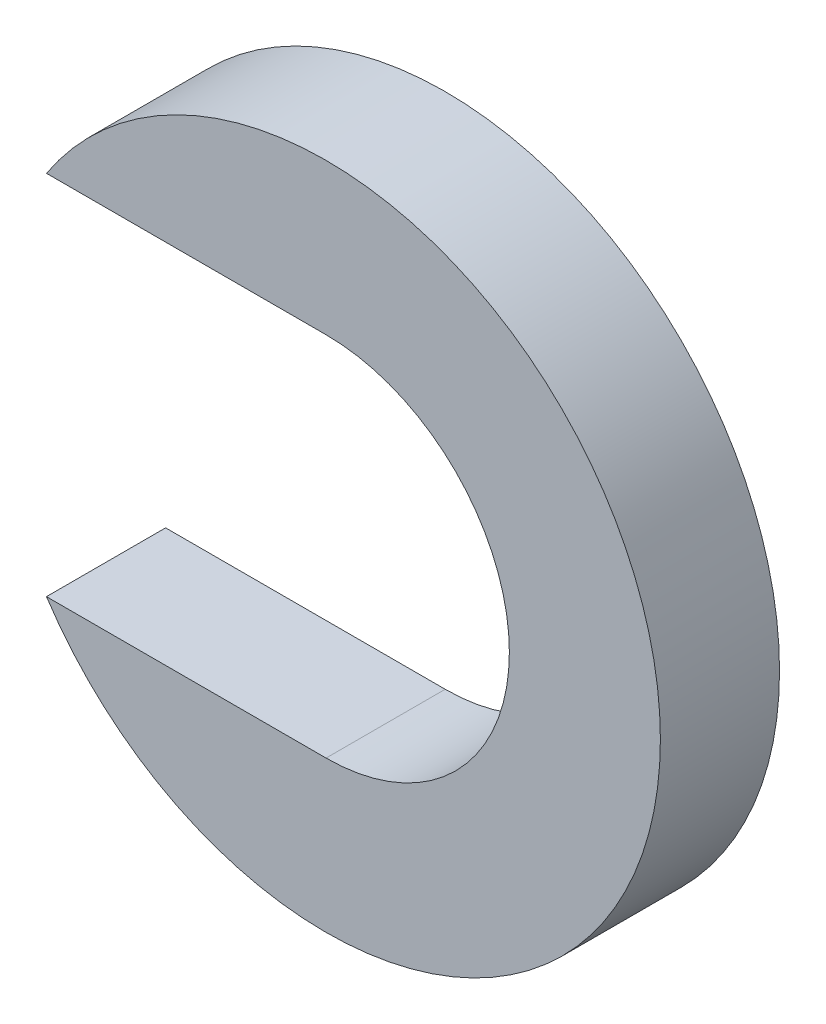
ISO-10303-21;
HEADER;
FILE_DESCRIPTION(('STEP AP214'),'2;1');
FILE_NAME('part.step','',(''),(''),'','','');
FILE_SCHEMA(('AUTOMOTIVE_DESIGN { 1 0 10303 214 1 1 1 1 }'));
ENDSEC;
DATA;
#1=APPLICATION_CONTEXT('core data for automotive mechanical design processes');
#2=APPLICATION_PROTOCOL_DEFINITION('international standard','automotive_design',2000,#1);
#3=PRODUCT_CONTEXT('',#1,'mechanical');
#4=PRODUCT('Part','Part','',(#3));
#5=PRODUCT_RELATED_PRODUCT_CATEGORY('part','',(#4));
#6=PRODUCT_DEFINITION_FORMATION('','',#4);
#7=PRODUCT_DEFINITION_CONTEXT('part definition',#1,'design');
#8=PRODUCT_DEFINITION('design','',#6,#7);
#9=PRODUCT_DEFINITION_SHAPE('','',#8);
#10=(LENGTH_UNIT() NAMED_UNIT(*) SI_UNIT(.MILLI.,.METRE.));
#11=(NAMED_UNIT(*) PLANE_ANGLE_UNIT() SI_UNIT($,.RADIAN.));
#12=(NAMED_UNIT(*) SI_UNIT($,.STERADIAN.) SOLID_ANGLE_UNIT());
#13=UNCERTAINTY_MEASURE_WITH_UNIT(LENGTH_MEASURE(1.E-05),#10,'distance_accuracy_value','');
#14=(GEOMETRIC_REPRESENTATION_CONTEXT(3) GLOBAL_UNCERTAINTY_ASSIGNED_CONTEXT((#13)) GLOBAL_UNIT_ASSIGNED_CONTEXT((#10,
#11,#12)) REPRESENTATION_CONTEXT('',''));
#15=CARTESIAN_POINT('',(0.,0.,0.));
#16=DIRECTION('',(0.,0.,1.));
#17=DIRECTION('',(1.,0.,0.));
#18=AXIS2_PLACEMENT_3D('',#15,#16,#17);
#19=CARTESIAN_POINT('',(0.,0.,3.25));
#20=DIRECTION('',(0.,0.,-1.));
#21=DIRECTION('',(-1.,0.,0.));
#22=AXIS2_PLACEMENT_3D('',#19,#20,#21);
#23=CYLINDRICAL_SURFACE('',#22,5.);
#24=CARTESIAN_POINT('',(0.,0.,0.));
#25=DIRECTION('',(0.,0.,1.));
#26=DIRECTION('',(1.,0.,0.));
#27=AXIS2_PLACEMENT_3D('',#24,#25,#26);
#28=CIRCLE('',#27,5.);
#29=CARTESIAN_POINT('',(0.,-5.,0.));
#30=VERTEX_POINT('',#29);
#31=CARTESIAN_POINT('',(0.,5.,0.));
#32=VERTEX_POINT('',#31);
#33=EDGE_CURVE('E98',#30,#32,#28,.T.);
#34=ORIENTED_EDGE('',*,*,#33,.F.);
#35=DIRECTION('',(0.,0.,-1.));
#36=VECTOR('',#35,1.);
#37=CARTESIAN_POINT('',(0.,-5.,3.25));
#38=LINE('',#37,#36);
#39=CARTESIAN_POINT('',(0.,-5.,3.25));
#40=VERTEX_POINT('',#39);
#41=EDGE_CURVE('E11',#40,#30,#38,.T.);
#42=ORIENTED_EDGE('',*,*,#41,.F.);
#43=CARTESIAN_POINT('',(0.,0.,3.25));
#44=DIRECTION('',(0.,0.,1.));
#45=DIRECTION('',(1.,0.,0.));
#46=AXIS2_PLACEMENT_3D('',#43,#44,#45);
#47=CIRCLE('',#46,5.);
#48=CARTESIAN_POINT('',(0.,5.,3.25));
#49=VERTEX_POINT('',#48);
#50=EDGE_CURVE('E92',#40,#49,#47,.T.);
#51=ORIENTED_EDGE('',*,*,#50,.T.);
#52=DIRECTION('',(0.,0.,-1.));
#53=VECTOR('',#52,1.);
#54=CARTESIAN_POINT('',(0.,5.,3.25));
#55=LINE('',#54,#53);
#56=EDGE_CURVE('E73',#49,#32,#55,.T.);
#57=ORIENTED_EDGE('',*,*,#56,.T.);
#58=EDGE_LOOP('',(#34,#42,#51,#57));
#59=FACE_BOUND('',#58,.T.);
#60=ADVANCED_FACE('F35',(#59),#23,.F.);
#61=CARTESIAN_POINT('',(0.,-5.,3.25));
#62=DIRECTION('',(0.,1.,0.));
#63=DIRECTION('',(0.,0.,1.));
#64=AXIS2_PLACEMENT_3D('',#61,#62,#63);
#65=PLANE('',#64);
#66=DIRECTION('',(1.,0.,0.));
#67=VECTOR('',#66,1.);
#68=CARTESIAN_POINT('',(0.,-5.,0.));
#69=LINE('',#68,#67);
#70=CARTESIAN_POINT('',(-7.62721443254351,-5.,0.));
#71=VERTEX_POINT('',#70);
#72=EDGE_CURVE('E86',#71,#30,#69,.T.);
#73=ORIENTED_EDGE('',*,*,#72,.F.);
#74=DIRECTION('',(0.,0.,-1.));
#75=VECTOR('',#74,1.);
#76=CARTESIAN_POINT('',(-7.62721443254351,-5.,3.25));
#77=LINE('',#76,#75);
#78=CARTESIAN_POINT('',(-7.62721443254351,-5.,3.25));
#79=VERTEX_POINT('',#78);
#80=EDGE_CURVE('E43',#79,#71,#77,.T.);
#81=ORIENTED_EDGE('',*,*,#80,.F.);
#82=DIRECTION('',(1.,0.,0.));
#83=VECTOR('',#82,1.);
#84=CARTESIAN_POINT('',(0.,-5.,3.25));
#85=LINE('',#84,#83);
#86=EDGE_CURVE('E84',#79,#40,#85,.T.);
#87=ORIENTED_EDGE('',*,*,#86,.T.);
#88=ORIENTED_EDGE('',*,*,#41,.T.);
#89=EDGE_LOOP('',(#73,#81,#87,#88));
#90=FACE_BOUND('',#89,.T.);
#91=ADVANCED_FACE('F82',(#90),#65,.T.);
#92=CARTESIAN_POINT('',(0.,0.,3.25));
#93=DIRECTION('',(0.,0.,-1.));
#94=DIRECTION('',(-1.,0.,0.));
#95=AXIS2_PLACEMENT_3D('',#92,#93,#94);
#96=CYLINDRICAL_SURFACE('',#95,9.12);
#97=CARTESIAN_POINT('',(0.,0.,0.));
#98=DIRECTION('',(0.,0.,1.));
#99=DIRECTION('',(1.,0.,0.));
#100=AXIS2_PLACEMENT_3D('',#97,#98,#99);
#101=CIRCLE('',#100,9.12);
#102=CARTESIAN_POINT('',(-7.62721443254351,5.,0.));
#103=VERTEX_POINT('',#102);
#104=EDGE_CURVE('E66',#71,#103,#101,.T.);
#105=ORIENTED_EDGE('',*,*,#104,.T.);
#106=DIRECTION('',(0.,0.,-1.));
#107=VECTOR('',#106,1.);
#108=CARTESIAN_POINT('',(-7.62721443254351,5.,3.25));
#109=LINE('',#108,#107);
#110=CARTESIAN_POINT('',(-7.62721443254351,5.,3.25));
#111=VERTEX_POINT('',#110);
#112=EDGE_CURVE('E87',#111,#103,#109,.T.);
#113=ORIENTED_EDGE('',*,*,#112,.F.);
#114=CARTESIAN_POINT('',(0.,0.,3.25));
#115=DIRECTION('',(0.,0.,1.));
#116=DIRECTION('',(1.,0.,0.));
#117=AXIS2_PLACEMENT_3D('',#114,#115,#116);
#118=CIRCLE('',#117,9.12);
#119=EDGE_CURVE('E88',#79,#111,#118,.T.);
#120=ORIENTED_EDGE('',*,*,#119,.F.);
#121=ORIENTED_EDGE('',*,*,#80,.T.);
#122=EDGE_LOOP('',(#105,#113,#120,#121));
#123=FACE_BOUND('',#122,.T.);
#124=ADVANCED_FACE('F89',(#123),#96,.T.);
#125=CARTESIAN_POINT('',(0.,5.,3.25));
#126=DIRECTION('',(0.,1.,0.));
#127=DIRECTION('',(0.,0.,1.));
#128=AXIS2_PLACEMENT_3D('',#125,#126,#127);
#129=PLANE('',#128);
#130=DIRECTION('',(1.,0.,0.));
#131=VECTOR('',#130,1.);
#132=CARTESIAN_POINT('',(0.,5.,0.));
#133=LINE('',#132,#131);
#134=EDGE_CURVE('E94',#103,#32,#133,.T.);
#135=ORIENTED_EDGE('',*,*,#134,.T.);
#136=ORIENTED_EDGE('',*,*,#56,.F.);
#137=DIRECTION('',(1.,0.,0.));
#138=VECTOR('',#137,1.);
#139=CARTESIAN_POINT('',(0.,5.,3.25));
#140=LINE('',#139,#138);
#141=EDGE_CURVE('E51',#111,#49,#140,.T.);
#142=ORIENTED_EDGE('',*,*,#141,.F.);
#143=ORIENTED_EDGE('',*,*,#112,.T.);
#144=EDGE_LOOP('',(#135,#136,#142,#143));
#145=FACE_BOUND('',#144,.T.);
#146=ADVANCED_FACE('F107',(#145),#129,.F.);
#147=CARTESIAN_POINT('',(0.,0.,3.25));
#148=DIRECTION('',(0.,0.,1.));
#149=DIRECTION('',(1.,0.,0.));
#150=AXIS2_PLACEMENT_3D('',#147,#148,#149);
#151=PLANE('',#150);
#152=ORIENTED_EDGE('',*,*,#50,.F.);
#153=ORIENTED_EDGE('',*,*,#86,.F.);
#154=ORIENTED_EDGE('',*,*,#119,.T.);
#155=ORIENTED_EDGE('',*,*,#141,.T.);
#156=EDGE_LOOP('',(#152,#153,#154,#155));
#157=FACE_BOUND('',#156,.T.);
#158=ADVANCED_FACE('F91',(#157),#151,.T.);
#159=CARTESIAN_POINT('',(0.,0.,0.));
#160=DIRECTION('',(0.,0.,1.));
#161=DIRECTION('',(1.,0.,0.));
#162=AXIS2_PLACEMENT_3D('',#159,#160,#161);
#163=PLANE('',#162);
#164=ORIENTED_EDGE('',*,*,#33,.T.);
#165=ORIENTED_EDGE('',*,*,#134,.F.);
#166=ORIENTED_EDGE('',*,*,#104,.F.);
#167=ORIENTED_EDGE('',*,*,#72,.T.);
#168=EDGE_LOOP('',(#164,#165,#166,#167));
#169=FACE_BOUND('',#168,.T.);
#170=ADVANCED_FACE('F109',(#169),#163,.F.);
#171=CLOSED_SHELL('',(#60,#91,#124,#146,#158,#170));
#172=MANIFOLD_SOLID_BREP('B2',#171);
#173=ADVANCED_BREP_SHAPE_REPRESENTATION('',(#18,#172),#14);
#174=SHAPE_DEFINITION_REPRESENTATION(#9,#173);
ENDSEC;
END-ISO-10303-21;
